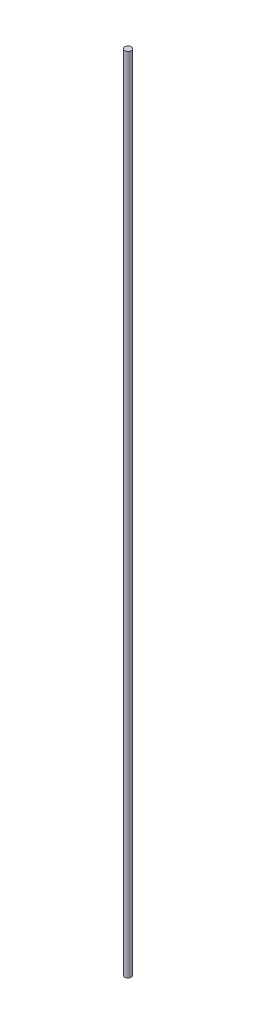
ISO-10303-21;
HEADER;
FILE_DESCRIPTION(('STEP AP214'),'2;1');
FILE_NAME('part.step','',(''),(''),'','','');
FILE_SCHEMA(('AUTOMOTIVE_DESIGN { 1 0 10303 214 1 1 1 1 }'));
ENDSEC;
DATA;
#1=APPLICATION_CONTEXT('core data for automotive mechanical design processes');
#2=APPLICATION_PROTOCOL_DEFINITION('international standard','automotive_design',2000,#1);
#3=PRODUCT_CONTEXT('',#1,'mechanical');
#4=PRODUCT('Part','Part','',(#3));
#5=PRODUCT_RELATED_PRODUCT_CATEGORY('part','',(#4));
#6=PRODUCT_DEFINITION_FORMATION('','',#4);
#7=PRODUCT_DEFINITION_CONTEXT('part definition',#1,'design');
#8=PRODUCT_DEFINITION('design','',#6,#7);
#9=PRODUCT_DEFINITION_SHAPE('','',#8);
#10=(LENGTH_UNIT() NAMED_UNIT(*) SI_UNIT(.MILLI.,.METRE.));
#11=(NAMED_UNIT(*) PLANE_ANGLE_UNIT() SI_UNIT($,.RADIAN.));
#12=(NAMED_UNIT(*) SI_UNIT($,.STERADIAN.) SOLID_ANGLE_UNIT());
#13=UNCERTAINTY_MEASURE_WITH_UNIT(LENGTH_MEASURE(1.E-05),#10,'distance_accuracy_value','');
#14=(GEOMETRIC_REPRESENTATION_CONTEXT(3) GLOBAL_UNCERTAINTY_ASSIGNED_CONTEXT((#13)) GLOBAL_UNIT_ASSIGNED_CONTEXT((#10,
#11,#12)) REPRESENTATION_CONTEXT('',''));
#15=CARTESIAN_POINT('',(0.,0.,0.));
#16=DIRECTION('',(0.,0.,1.));
#17=DIRECTION('',(1.,0.,0.));
#18=AXIS2_PLACEMENT_3D('',#15,#16,#17);
#19=CARTESIAN_POINT('',(0.,600.,0.));
#20=DIRECTION('',(0.,-1.,0.));
#21=DIRECTION('',(0.,0.,-1.));
#22=AXIS2_PLACEMENT_3D('',#19,#20,#21);
#23=CYLINDRICAL_SURFACE('',#22,2.5);
#24=CARTESIAN_POINT('',(0.,600.,0.));
#25=DIRECTION('',(0.,1.,0.));
#26=DIRECTION('',(0.,0.,1.));
#27=AXIS2_PLACEMENT_3D('',#24,#25,#26);
#28=CIRCLE('',#27,2.5);
#29=CARTESIAN_POINT('',(0.,600.,2.5));
#30=VERTEX_POINT('',#29);
#31=EDGE_CURVE('E10',#30,#30,#28,.T.);
#32=ORIENTED_EDGE('',*,*,#31,.F.);
#33=EDGE_LOOP('',(#32));
#34=FACE_BOUND('',#33,.T.);
#35=CARTESIAN_POINT('',(0.,0.,0.));
#36=DIRECTION('',(0.,1.,0.));
#37=DIRECTION('',(0.,0.,1.));
#38=AXIS2_PLACEMENT_3D('',#35,#36,#37);
#39=CIRCLE('',#38,2.5);
#40=CARTESIAN_POINT('',(0.,0.,2.5));
#41=VERTEX_POINT('',#40);
#42=EDGE_CURVE('E40',#41,#41,#39,.T.);
#43=ORIENTED_EDGE('',*,*,#42,.T.);
#44=EDGE_LOOP('',(#43));
#45=FACE_BOUND('',#44,.T.);
#46=ADVANCED_FACE('F37',(#34,#45),#23,.T.);
#47=CARTESIAN_POINT('',(0.,600.,0.));
#48=DIRECTION('',(0.,1.,0.));
#49=DIRECTION('',(0.,0.,1.));
#50=AXIS2_PLACEMENT_3D('',#47,#48,#49);
#51=PLANE('',#50);
#52=ORIENTED_EDGE('',*,*,#31,.T.);
#53=EDGE_LOOP('',(#52));
#54=FACE_BOUND('',#53,.T.);
#55=ADVANCED_FACE('F52',(#54),#51,.T.);
#56=CARTESIAN_POINT('',(0.,0.,0.));
#57=DIRECTION('',(0.,1.,0.));
#58=DIRECTION('',(0.,0.,1.));
#59=AXIS2_PLACEMENT_3D('',#56,#57,#58);
#60=PLANE('',#59);
#61=ORIENTED_EDGE('',*,*,#42,.F.);
#62=EDGE_LOOP('',(#61));
#63=FACE_BOUND('',#62,.T.);
#64=ADVANCED_FACE('F50',(#63),#60,.F.);
#65=CLOSED_SHELL('',(#46,#55,#64));
#66=MANIFOLD_SOLID_BREP('B2',#65);
#67=ADVANCED_BREP_SHAPE_REPRESENTATION('',(#18,#66),#14);
#68=SHAPE_DEFINITION_REPRESENTATION(#9,#67);
ENDSEC;
END-ISO-10303-21;
